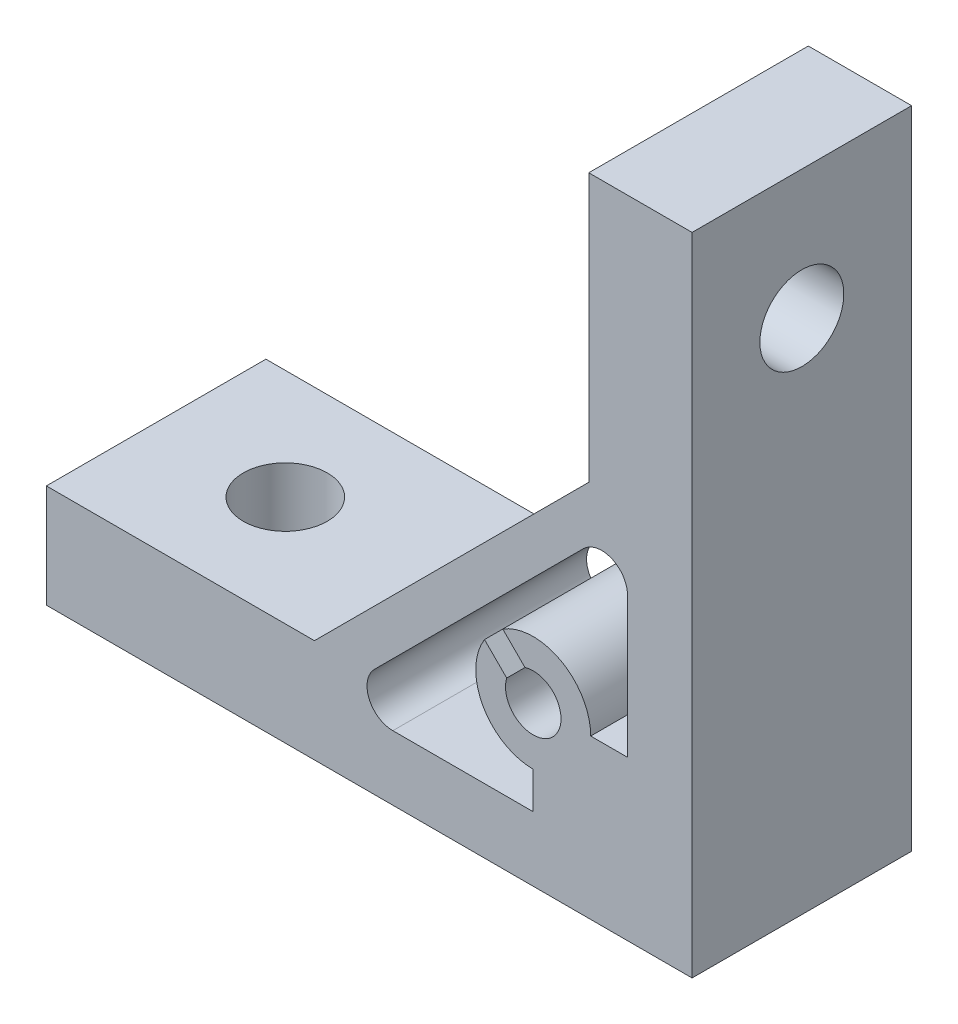
ISO-10303-21;
HEADER;
FILE_DESCRIPTION(('STEP AP214'),'2;1');
FILE_NAME('part.step','',(''),(''),'','','');
FILE_SCHEMA(('AUTOMOTIVE_DESIGN { 1 0 10303 214 1 1 1 1 }'));
ENDSEC;
DATA;
#1=APPLICATION_CONTEXT('core data for automotive mechanical design processes');
#2=APPLICATION_PROTOCOL_DEFINITION('international standard','automotive_design',2000,#1);
#3=PRODUCT_CONTEXT('',#1,'mechanical');
#4=PRODUCT('Part','Part','',(#3));
#5=PRODUCT_RELATED_PRODUCT_CATEGORY('part','',(#4));
#6=PRODUCT_DEFINITION_FORMATION('','',#4);
#7=PRODUCT_DEFINITION_CONTEXT('part definition',#1,'design');
#8=PRODUCT_DEFINITION('design','',#6,#7);
#9=PRODUCT_DEFINITION_SHAPE('','',#8);
#10=(LENGTH_UNIT() NAMED_UNIT(*) SI_UNIT(.MILLI.,.METRE.));
#11=(NAMED_UNIT(*) PLANE_ANGLE_UNIT() SI_UNIT($,.RADIAN.));
#12=(NAMED_UNIT(*) SI_UNIT($,.STERADIAN.) SOLID_ANGLE_UNIT());
#13=UNCERTAINTY_MEASURE_WITH_UNIT(LENGTH_MEASURE(1.E-05),#10,'distance_accuracy_value','');
#14=(GEOMETRIC_REPRESENTATION_CONTEXT(3) GLOBAL_UNCERTAINTY_ASSIGNED_CONTEXT((#13)) GLOBAL_UNIT_ASSIGNED_CONTEXT((#10,
#11,#12)) REPRESENTATION_CONTEXT('',''));
#15=CARTESIAN_POINT('',(0.,0.,0.));
#16=DIRECTION('',(0.,0.,1.));
#17=DIRECTION('',(1.,0.,0.));
#18=AXIS2_PLACEMENT_3D('',#15,#16,#17);
#19=CARTESIAN_POINT('',(50.,0.,8.5));
#20=DIRECTION('',(-1.,0.,0.));
#21=DIRECTION('',(0.,0.,1.));
#22=AXIS2_PLACEMENT_3D('',#19,#20,#21);
#23=PLANE('',#22);
#24=DIRECTION('',(0.,1.,0.));
#25=VECTOR('',#24,1.);
#26=CARTESIAN_POINT('',(50.,0.,-8.5));
#27=LINE('',#26,#25);
#28=CARTESIAN_POINT('',(50.,0.,-8.5));
#29=VERTEX_POINT('',#28);
#30=CARTESIAN_POINT('',(50.,50.,-8.5));
#31=VERTEX_POINT('',#30);
#32=EDGE_CURVE('E283',#29,#31,#27,.T.);
#33=ORIENTED_EDGE('',*,*,#32,.T.);
#34=DIRECTION('',(0.,0.,-1.));
#35=VECTOR('',#34,1.);
#36=CARTESIAN_POINT('',(50.,50.,8.5));
#37=LINE('',#36,#35);
#38=CARTESIAN_POINT('',(50.,50.,8.5));
#39=VERTEX_POINT('',#38);
#40=EDGE_CURVE('E303',#39,#31,#37,.T.);
#41=ORIENTED_EDGE('',*,*,#40,.F.);
#42=DIRECTION('',(0.,1.,0.));
#43=VECTOR('',#42,1.);
#44=CARTESIAN_POINT('',(50.,0.,8.5));
#45=LINE('',#44,#43);
#46=CARTESIAN_POINT('',(50.,0.,8.5));
#47=VERTEX_POINT('',#46);
#48=EDGE_CURVE('E268',#47,#39,#45,.T.);
#49=ORIENTED_EDGE('',*,*,#48,.F.);
#50=DIRECTION('',(0.,0.,-1.));
#51=VECTOR('',#50,1.);
#52=CARTESIAN_POINT('',(50.,0.,8.5));
#53=LINE('',#52,#51);
#54=EDGE_CURVE('E43',#47,#29,#53,.T.);
#55=ORIENTED_EDGE('',*,*,#54,.T.);
#56=EDGE_LOOP('',(#33,#41,#49,#55));
#57=FACE_BOUND('',#56,.T.);
#58=CARTESIAN_POINT('',(50.,40.,0.));
#59=DIRECTION('',(-1.,0.,0.));
#60=DIRECTION('',(0.,0.,1.));
#61=AXIS2_PLACEMENT_3D('',#58,#59,#60);
#62=CIRCLE('',#61,3.25);
#63=CARTESIAN_POINT('',(50.,40.,3.25));
#64=VERTEX_POINT('',#63);
#65=EDGE_CURVE('E368',#64,#64,#62,.F.);
#66=ORIENTED_EDGE('',*,*,#65,.F.);
#67=EDGE_LOOP('',(#66));
#68=FACE_BOUND('',#67,.T.);
#69=ADVANCED_FACE('F35',(#57,#68),#23,.F.);
#70=CARTESIAN_POINT('',(42.,29.2426406871192,8.5));
#71=DIRECTION('',(1.,0.,0.));
#72=DIRECTION('',(0.,0.,-1.));
#73=AXIS2_PLACEMENT_3D('',#70,#71,#72);
#74=PLANE('',#73);
#75=DIRECTION('',(0.,-1.,0.));
#76=VECTOR('',#75,1.);
#77=CARTESIAN_POINT('',(42.,29.2426406871192,-8.5));
#78=LINE('',#77,#76);
#79=CARTESIAN_POINT('',(42.,50.,-8.5));
#80=VERTEX_POINT('',#79);
#81=CARTESIAN_POINT('',(42.,29.2426406871192,-8.5));
#82=VERTEX_POINT('',#81);
#83=EDGE_CURVE('E287',#80,#82,#78,.T.);
#84=ORIENTED_EDGE('',*,*,#83,.T.);
#85=DIRECTION('',(0.,0.,-1.));
#86=VECTOR('',#85,1.);
#87=CARTESIAN_POINT('',(42.,29.2426406871192,8.5));
#88=LINE('',#87,#86);
#89=CARTESIAN_POINT('',(42.,29.2426406871192,8.5));
#90=VERTEX_POINT('',#89);
#91=EDGE_CURVE('E297',#90,#82,#88,.T.);
#92=ORIENTED_EDGE('',*,*,#91,.F.);
#93=DIRECTION('',(0.,-1.,0.));
#94=VECTOR('',#93,1.);
#95=CARTESIAN_POINT('',(42.,29.2426406871192,8.5));
#96=LINE('',#95,#94);
#97=CARTESIAN_POINT('',(42.,50.,8.5));
#98=VERTEX_POINT('',#97);
#99=EDGE_CURVE('E272',#98,#90,#96,.T.);
#100=ORIENTED_EDGE('',*,*,#99,.F.);
#101=DIRECTION('',(0.,0.,-1.));
#102=VECTOR('',#101,1.);
#103=CARTESIAN_POINT('',(42.,50.,8.5));
#104=LINE('',#103,#102);
#105=EDGE_CURVE('E300',#98,#80,#104,.T.);
#106=ORIENTED_EDGE('',*,*,#105,.T.);
#107=EDGE_LOOP('',(#84,#92,#100,#106));
#108=FACE_BOUND('',#107,.T.);
#109=CARTESIAN_POINT('',(42.0000000000001,40.,0.));
#110=DIRECTION('',(1.,0.,0.));
#111=DIRECTION('',(0.,0.,1.));
#112=AXIS2_PLACEMENT_3D('',#109,#110,#111);
#113=CIRCLE('',#112,3.25);
#114=CARTESIAN_POINT('',(42.0000000000001,40.,3.25));
#115=VERTEX_POINT('',#114);
#116=EDGE_CURVE('E373',#115,#115,#113,.T.);
#117=ORIENTED_EDGE('',*,*,#116,.T.);
#118=EDGE_LOOP('',(#117));
#119=FACE_BOUND('',#118,.T.);
#120=ADVANCED_FACE('F326',(#108,#119),#74,.F.);
#121=CARTESIAN_POINT('',(0.,0.,8.5));
#122=DIRECTION('',(0.,0.,1.));
#123=DIRECTION('',(1.,0.,0.));
#124=AXIS2_PLACEMENT_3D('',#121,#122,#123);
#125=PLANE('',#124);
#126=DIRECTION('',(0.,-1.,0.));
#127=VECTOR('',#126,1.);
#128=CARTESIAN_POINT('',(0.,8.,8.5));
#129=LINE('',#128,#127);
#130=CARTESIAN_POINT('',(0.,8.,8.5));
#131=VERTEX_POINT('',#130);
#132=CARTESIAN_POINT('',(0.,0.,8.5));
#133=VERTEX_POINT('',#132);
#134=EDGE_CURVE('E262',#131,#133,#129,.T.);
#135=ORIENTED_EDGE('',*,*,#134,.T.);
#136=DIRECTION('',(1.,0.,0.));
#137=VECTOR('',#136,1.);
#138=CARTESIAN_POINT('',(0.,0.,8.5));
#139=LINE('',#138,#137);
#140=EDGE_CURVE('E265',#133,#47,#139,.T.);
#141=ORIENTED_EDGE('',*,*,#140,.T.);
#142=ORIENTED_EDGE('',*,*,#48,.T.);
#143=DIRECTION('',(-1.,0.,0.));
#144=VECTOR('',#143,1.);
#145=CARTESIAN_POINT('',(42.,50.,8.5));
#146=LINE('',#145,#144);
#147=EDGE_CURVE('E270',#39,#98,#146,.T.);
#148=ORIENTED_EDGE('',*,*,#147,.T.);
#149=ORIENTED_EDGE('',*,*,#99,.T.);
#150=DIRECTION('',(-0.707106781186546,-0.707106781186549,0.));
#151=VECTOR('',#150,1.);
#152=CARTESIAN_POINT('',(20.7573593128809,8.,8.5));
#153=LINE('',#152,#151);
#154=CARTESIAN_POINT('',(20.7573593128809,8.,8.5));
#155=VERTEX_POINT('',#154);
#156=EDGE_CURVE('E274',#90,#155,#153,.T.);
#157=ORIENTED_EDGE('',*,*,#156,.T.);
#158=DIRECTION('',(-1.,0.,0.));
#159=VECTOR('',#158,1.);
#160=CARTESIAN_POINT('',(0.,8.,8.5));
#161=LINE('',#160,#159);
#162=EDGE_CURVE('E276',#155,#131,#161,.T.);
#163=ORIENTED_EDGE('',*,*,#162,.T.);
#164=EDGE_LOOP('',(#135,#141,#142,#148,#149,#157,#163));
#165=FACE_BOUND('',#164,.T.);
#166=DIRECTION('',(0.707106781186549,-0.707106781186546,0.));
#167=VECTOR('',#166,1.);
#168=CARTESIAN_POINT('',(35.647066335444,12.9387201021829,8.5));
#169=LINE('',#168,#167);
#170=CARTESIAN_POINT('',(33.9267474297161,14.6590390079109,8.5));
#171=VERTEX_POINT('',#170);
#172=CARTESIAN_POINT('',(35.647066335444,12.9387201021829,8.5));
#173=VERTEX_POINT('',#172);
#174=EDGE_CURVE('E174',#171,#173,#169,.T.);
#175=ORIENTED_EDGE('',*,*,#174,.F.);
#176=CARTESIAN_POINT('',(37.7,12.3,8.5));
#177=DIRECTION('',(0.,0.,-1.));
#178=DIRECTION('',(1.,0.,0.));
#179=AXIS2_PLACEMENT_3D('',#176,#177,#178);
#180=CIRCLE('',#179,4.45);
#181=CARTESIAN_POINT('',(37.7,7.84999999999995,8.5));
#182=VERTEX_POINT('',#181);
#183=EDGE_CURVE('E166',#182,#171,#180,.T.);
#184=ORIENTED_EDGE('',*,*,#183,.F.);
#185=DIRECTION('',(0.,1.,0.));
#186=VECTOR('',#185,1.);
#187=CARTESIAN_POINT('',(37.7,5.,8.5));
#188=LINE('',#187,#186);
#189=CARTESIAN_POINT('',(37.7,5.,8.5));
#190=VERTEX_POINT('',#189);
#191=EDGE_CURVE('E209',#190,#182,#188,.T.);
#192=ORIENTED_EDGE('',*,*,#191,.F.);
#193=DIRECTION('',(1.,0.,0.));
#194=VECTOR('',#193,1.);
#195=CARTESIAN_POINT('',(26.828427124746,5.,8.5));
#196=LINE('',#195,#194);
#197=CARTESIAN_POINT('',(26.828427124746,4.99999999999993,8.5));
#198=VERTEX_POINT('',#197);
#199=EDGE_CURVE('E207',#198,#190,#196,.T.);
#200=ORIENTED_EDGE('',*,*,#199,.F.);
#201=CARTESIAN_POINT('',(26.8284271247464,7.00000000000011,8.5));
#202=DIRECTION('',(0.,0.,1.));
#203=DIRECTION('',(1.,0.,0.));
#204=AXIS2_PLACEMENT_3D('',#201,#202,#203);
#205=CIRCLE('',#204,2.00000000000019);
#206=CARTESIAN_POINT('',(25.4142135623729,8.41421356237311,8.5));
#207=VERTEX_POINT('',#206);
#208=EDGE_CURVE('E205',#207,#198,#205,.T.);
#209=ORIENTED_EDGE('',*,*,#208,.F.);
#210=DIRECTION('',(-0.70710678118655,-0.707106781186545,0.));
#211=VECTOR('',#210,1.);
#212=CARTESIAN_POINT('',(25.4142135623729,8.41421356237311,8.5));
#213=LINE('',#212,#211);
#214=CARTESIAN_POINT('',(41.585786437627,24.5857864376269,8.5));
#215=VERTEX_POINT('',#214);
#216=EDGE_CURVE('E203',#215,#207,#213,.T.);
#217=ORIENTED_EDGE('',*,*,#216,.F.);
#218=CARTESIAN_POINT('',(43.0000000000002,23.171572875254,8.5));
#219=DIRECTION('',(0.,0.,1.));
#220=DIRECTION('',(1.,0.,0.));
#221=AXIS2_PLACEMENT_3D('',#218,#219,#220);
#222=CIRCLE('',#221,1.99999999999993);
#223=CARTESIAN_POINT('',(45.,23.1715728752539,8.5));
#224=VERTEX_POINT('',#223);
#225=EDGE_CURVE('E201',#224,#215,#222,.T.);
#226=ORIENTED_EDGE('',*,*,#225,.F.);
#227=DIRECTION('',(0.,1.,0.));
#228=VECTOR('',#227,1.);
#229=CARTESIAN_POINT('',(45.,23.1715728752539,8.5));
#230=LINE('',#229,#228);
#231=CARTESIAN_POINT('',(45.,12.3,8.5));
#232=VERTEX_POINT('',#231);
#233=EDGE_CURVE('E199',#232,#224,#230,.T.);
#234=ORIENTED_EDGE('',*,*,#233,.F.);
#235=DIRECTION('',(1.,0.,0.));
#236=VECTOR('',#235,1.);
#237=CARTESIAN_POINT('',(42.15,12.3,8.5));
#238=LINE('',#237,#236);
#239=CARTESIAN_POINT('',(42.15,12.3,8.5));
#240=VERTEX_POINT('',#239);
#241=EDGE_CURVE('E197',#240,#232,#238,.T.);
#242=ORIENTED_EDGE('',*,*,#241,.F.);
#243=CARTESIAN_POINT('',(37.7,12.3,8.5));
#244=DIRECTION('',(0.,0.,-1.));
#245=DIRECTION('',(1.,0.,0.));
#246=AXIS2_PLACEMENT_3D('',#243,#244,#245);
#247=CIRCLE('',#246,4.45);
#248=CARTESIAN_POINT('',(35.3409609920885,16.0732525702836,8.5));
#249=VERTEX_POINT('',#248);
#250=EDGE_CURVE('E195',#249,#240,#247,.T.);
#251=ORIENTED_EDGE('',*,*,#250,.F.);
#252=DIRECTION('',(-0.707106781186684,0.707106781186411,0.));
#253=VECTOR('',#252,1.);
#254=CARTESIAN_POINT('',(37.0612798978168,14.3529336645559,8.5));
#255=LINE('',#254,#253);
#256=CARTESIAN_POINT('',(37.0612798978168,14.3529336645559,8.5));
#257=VERTEX_POINT('',#256);
#258=EDGE_CURVE('E190',#257,#249,#255,.T.);
#259=ORIENTED_EDGE('',*,*,#258,.F.);
#260=CARTESIAN_POINT('',(37.7,12.3,8.5));
#261=DIRECTION('',(0.,0.,1.));
#262=DIRECTION('',(1.,0.,0.));
#263=AXIS2_PLACEMENT_3D('',#260,#261,#262);
#264=CIRCLE('',#263,2.15);
#265=EDGE_CURVE('E188',#173,#257,#264,.T.);
#266=ORIENTED_EDGE('',*,*,#265,.F.);
#267=EDGE_LOOP('',(#175,#184,#192,#200,#209,#217,#226,#234,#242,#251,#259,#266));
#268=FACE_BOUND('',#267,.T.);
#269=ADVANCED_FACE('F186',(#165,#268),#125,.T.);
#270=CARTESIAN_POINT('',(0.,0.,-8.5));
#271=DIRECTION('',(0.,0.,1.));
#272=DIRECTION('',(1.,0.,0.));
#273=AXIS2_PLACEMENT_3D('',#270,#271,#272);
#274=PLANE('',#273);
#275=DIRECTION('',(0.,-1.,0.));
#276=VECTOR('',#275,1.);
#277=CARTESIAN_POINT('',(0.,8.,-8.5));
#278=LINE('',#277,#276);
#279=CARTESIAN_POINT('',(0.,8.,-8.5));
#280=VERTEX_POINT('',#279);
#281=CARTESIAN_POINT('',(0.,0.,-8.5));
#282=VERTEX_POINT('',#281);
#283=EDGE_CURVE('E182',#280,#282,#278,.T.);
#284=ORIENTED_EDGE('',*,*,#283,.F.);
#285=DIRECTION('',(-1.,0.,0.));
#286=VECTOR('',#285,1.);
#287=CARTESIAN_POINT('',(0.,8.,-8.5));
#288=LINE('',#287,#286);
#289=CARTESIAN_POINT('',(20.7573593128809,8.,-8.5));
#290=VERTEX_POINT('',#289);
#291=EDGE_CURVE('E266',#290,#280,#288,.T.);
#292=ORIENTED_EDGE('',*,*,#291,.F.);
#293=DIRECTION('',(-0.707106781186546,-0.707106781186549,0.));
#294=VECTOR('',#293,1.);
#295=CARTESIAN_POINT('',(20.7573593128809,8.,-8.5));
#296=LINE('',#295,#294);
#297=EDGE_CURVE('E289',#82,#290,#296,.T.);
#298=ORIENTED_EDGE('',*,*,#297,.F.);
#299=ORIENTED_EDGE('',*,*,#83,.F.);
#300=DIRECTION('',(-1.,0.,0.));
#301=VECTOR('',#300,1.);
#302=CARTESIAN_POINT('',(42.,50.,-8.5));
#303=LINE('',#302,#301);
#304=EDGE_CURVE('E285',#31,#80,#303,.T.);
#305=ORIENTED_EDGE('',*,*,#304,.F.);
#306=ORIENTED_EDGE('',*,*,#32,.F.);
#307=DIRECTION('',(1.,0.,0.));
#308=VECTOR('',#307,1.);
#309=CARTESIAN_POINT('',(0.,0.,-8.5));
#310=LINE('',#309,#308);
#311=EDGE_CURVE('E281',#282,#29,#310,.T.);
#312=ORIENTED_EDGE('',*,*,#311,.F.);
#313=EDGE_LOOP('',(#284,#292,#298,#299,#305,#306,#312));
#314=FACE_BOUND('',#313,.T.);
#315=CARTESIAN_POINT('',(37.7,12.3,-8.5));
#316=DIRECTION('',(0.,0.,-1.));
#317=DIRECTION('',(1.,0.,0.));
#318=AXIS2_PLACEMENT_3D('',#315,#316,#317);
#319=CIRCLE('',#318,4.45);
#320=CARTESIAN_POINT('',(37.7,7.84999999999995,-8.5));
#321=VERTEX_POINT('',#320);
#322=CARTESIAN_POINT('',(33.9267474297161,14.6590390079109,-8.5));
#323=VERTEX_POINT('',#322);
#324=EDGE_CURVE('E58',#321,#323,#319,.T.);
#325=ORIENTED_EDGE('',*,*,#324,.T.);
#326=DIRECTION('',(0.707106781186549,-0.707106781186546,0.));
#327=VECTOR('',#326,1.);
#328=CARTESIAN_POINT('',(35.647066335444,12.9387201021829,-8.5));
#329=LINE('',#328,#327);
#330=CARTESIAN_POINT('',(35.647066335444,12.9387201021829,-8.5));
#331=VERTEX_POINT('',#330);
#332=EDGE_CURVE('E181',#323,#331,#329,.T.);
#333=ORIENTED_EDGE('',*,*,#332,.T.);
#334=CARTESIAN_POINT('',(37.7,12.3,-8.5));
#335=DIRECTION('',(0.,0.,1.));
#336=DIRECTION('',(1.,0.,0.));
#337=AXIS2_PLACEMENT_3D('',#334,#335,#336);
#338=CIRCLE('',#337,2.15);
#339=CARTESIAN_POINT('',(37.0612798978168,14.3529336645559,-8.5));
#340=VERTEX_POINT('',#339);
#341=EDGE_CURVE('E214',#331,#340,#338,.T.);
#342=ORIENTED_EDGE('',*,*,#341,.T.);
#343=DIRECTION('',(-0.707106781186684,0.707106781186411,0.));
#344=VECTOR('',#343,1.);
#345=CARTESIAN_POINT('',(37.0612798978168,14.3529336645559,-8.5));
#346=LINE('',#345,#344);
#347=CARTESIAN_POINT('',(35.3409609920885,16.0732525702836,-8.5));
#348=VERTEX_POINT('',#347);
#349=EDGE_CURVE('E217',#340,#348,#346,.T.);
#350=ORIENTED_EDGE('',*,*,#349,.T.);
#351=CARTESIAN_POINT('',(37.7,12.3,-8.5));
#352=DIRECTION('',(0.,0.,-1.));
#353=DIRECTION('',(1.,0.,0.));
#354=AXIS2_PLACEMENT_3D('',#351,#352,#353);
#355=CIRCLE('',#354,4.45);
#356=CARTESIAN_POINT('',(42.15,12.3,-8.5));
#357=VERTEX_POINT('',#356);
#358=EDGE_CURVE('E220',#348,#357,#355,.T.);
#359=ORIENTED_EDGE('',*,*,#358,.T.);
#360=DIRECTION('',(1.,0.,0.));
#361=VECTOR('',#360,1.);
#362=CARTESIAN_POINT('',(42.15,12.3,-8.5));
#363=LINE('',#362,#361);
#364=CARTESIAN_POINT('',(45.,12.3,-8.5));
#365=VERTEX_POINT('',#364);
#366=EDGE_CURVE('E223',#357,#365,#363,.T.);
#367=ORIENTED_EDGE('',*,*,#366,.T.);
#368=DIRECTION('',(0.,1.,0.));
#369=VECTOR('',#368,1.);
#370=CARTESIAN_POINT('',(45.,23.1715728752539,-8.5));
#371=LINE('',#370,#369);
#372=CARTESIAN_POINT('',(45.,23.1715728752539,-8.5));
#373=VERTEX_POINT('',#372);
#374=EDGE_CURVE('E226',#365,#373,#371,.T.);
#375=ORIENTED_EDGE('',*,*,#374,.T.);
#376=CARTESIAN_POINT('',(43.0000000000002,23.171572875254,-8.5));
#377=DIRECTION('',(0.,0.,1.));
#378=DIRECTION('',(1.,0.,0.));
#379=AXIS2_PLACEMENT_3D('',#376,#377,#378);
#380=CIRCLE('',#379,1.99999999999993);
#381=CARTESIAN_POINT('',(41.585786437627,24.5857864376269,-8.5));
#382=VERTEX_POINT('',#381);
#383=EDGE_CURVE('E229',#373,#382,#380,.T.);
#384=ORIENTED_EDGE('',*,*,#383,.T.);
#385=DIRECTION('',(-0.70710678118655,-0.707106781186545,0.));
#386=VECTOR('',#385,1.);
#387=CARTESIAN_POINT('',(25.4142135623729,8.41421356237311,-8.5));
#388=LINE('',#387,#386);
#389=CARTESIAN_POINT('',(25.4142135623729,8.41421356237311,-8.5));
#390=VERTEX_POINT('',#389);
#391=EDGE_CURVE('E232',#382,#390,#388,.T.);
#392=ORIENTED_EDGE('',*,*,#391,.T.);
#393=CARTESIAN_POINT('',(26.8284271247464,7.00000000000011,-8.5));
#394=DIRECTION('',(0.,0.,1.));
#395=DIRECTION('',(1.,0.,0.));
#396=AXIS2_PLACEMENT_3D('',#393,#394,#395);
#397=CIRCLE('',#396,2.00000000000019);
#398=CARTESIAN_POINT('',(26.828427124746,4.99999999999993,-8.5));
#399=VERTEX_POINT('',#398);
#400=EDGE_CURVE('E235',#390,#399,#397,.T.);
#401=ORIENTED_EDGE('',*,*,#400,.T.);
#402=DIRECTION('',(1.,0.,0.));
#403=VECTOR('',#402,1.);
#404=CARTESIAN_POINT('',(26.828427124746,5.,-8.5));
#405=LINE('',#404,#403);
#406=CARTESIAN_POINT('',(37.7,5.,-8.5));
#407=VERTEX_POINT('',#406);
#408=EDGE_CURVE('E238',#399,#407,#405,.T.);
#409=ORIENTED_EDGE('',*,*,#408,.T.);
#410=DIRECTION('',(0.,1.,0.));
#411=VECTOR('',#410,1.);
#412=CARTESIAN_POINT('',(37.7,5.,-8.5));
#413=LINE('',#412,#411);
#414=EDGE_CURVE('E175',#407,#321,#413,.T.);
#415=ORIENTED_EDGE('',*,*,#414,.T.);
#416=EDGE_LOOP('',(#325,#333,#342,#350,#359,#367,#375,#384,#392,#401,#409,#415));
#417=FACE_BOUND('',#416,.T.);
#418=ADVANCED_FACE('F316',(#314,#417),#274,.F.);
#419=CARTESIAN_POINT('',(0.,8.,8.5));
#420=DIRECTION('',(1.,0.,0.));
#421=DIRECTION('',(0.,0.,-1.));
#422=AXIS2_PLACEMENT_3D('',#419,#420,#421);
#423=PLANE('',#422);
#424=ORIENTED_EDGE('',*,*,#283,.T.);
#425=DIRECTION('',(0.,0.,-1.));
#426=VECTOR('',#425,1.);
#427=CARTESIAN_POINT('',(0.,0.,8.5));
#428=LINE('',#427,#426);
#429=EDGE_CURVE('E11',#133,#282,#428,.T.);
#430=ORIENTED_EDGE('',*,*,#429,.F.);
#431=ORIENTED_EDGE('',*,*,#134,.F.);
#432=DIRECTION('',(0.,0.,-1.));
#433=VECTOR('',#432,1.);
#434=CARTESIAN_POINT('',(0.,8.,8.5));
#435=LINE('',#434,#433);
#436=EDGE_CURVE('E278',#131,#280,#435,.T.);
#437=ORIENTED_EDGE('',*,*,#436,.T.);
#438=EDGE_LOOP('',(#424,#430,#431,#437));
#439=FACE_BOUND('',#438,.T.);
#440=ADVANCED_FACE('F37',(#439),#423,.F.);
#441=CARTESIAN_POINT('',(0.,0.,8.5));
#442=DIRECTION('',(0.,1.,0.));
#443=DIRECTION('',(0.,0.,1.));
#444=AXIS2_PLACEMENT_3D('',#441,#442,#443);
#445=PLANE('',#444);
#446=CARTESIAN_POINT('',(10.,0.,0.));
#447=DIRECTION('',(0.,1.,0.));
#448=DIRECTION('',(0.,0.,1.));
#449=AXIS2_PLACEMENT_3D('',#446,#447,#448);
#450=CIRCLE('',#449,3.25);
#451=CARTESIAN_POINT('',(10.,0.,3.25));
#452=VERTEX_POINT('',#451);
#453=EDGE_CURVE('E212',#452,#452,#450,.T.);
#454=ORIENTED_EDGE('',*,*,#453,.T.);
#455=EDGE_LOOP('',(#454));
#456=FACE_BOUND('',#455,.T.);
#457=ORIENTED_EDGE('',*,*,#311,.T.);
#458=ORIENTED_EDGE('',*,*,#54,.F.);
#459=ORIENTED_EDGE('',*,*,#140,.F.);
#460=ORIENTED_EDGE('',*,*,#429,.T.);
#461=EDGE_LOOP('',(#457,#458,#459,#460));
#462=FACE_BOUND('',#461,.T.);
#463=ADVANCED_FACE('F334',(#456,#462),#445,.F.);
#464=CARTESIAN_POINT('',(42.,50.,8.5));
#465=DIRECTION('',(0.,-1.,0.));
#466=DIRECTION('',(0.,0.,-1.));
#467=AXIS2_PLACEMENT_3D('',#464,#465,#466);
#468=PLANE('',#467);
#469=ORIENTED_EDGE('',*,*,#304,.T.);
#470=ORIENTED_EDGE('',*,*,#105,.F.);
#471=ORIENTED_EDGE('',*,*,#147,.F.);
#472=ORIENTED_EDGE('',*,*,#40,.T.);
#473=EDGE_LOOP('',(#469,#470,#471,#472));
#474=FACE_BOUND('',#473,.T.);
#475=ADVANCED_FACE('F322',(#474),#468,.F.);
#476=CARTESIAN_POINT('',(20.7573593128809,8.,8.5));
#477=DIRECTION('',(0.707106781186549,-0.707106781186546,0.));
#478=DIRECTION('',(0.707106781186546,0.707106781186549,0.));
#479=AXIS2_PLACEMENT_3D('',#476,#477,#478);
#480=PLANE('',#479);
#481=ORIENTED_EDGE('',*,*,#297,.T.);
#482=DIRECTION('',(0.,0.,-1.));
#483=VECTOR('',#482,1.);
#484=CARTESIAN_POINT('',(20.7573593128809,8.,8.5));
#485=LINE('',#484,#483);
#486=EDGE_CURVE('E294',#155,#290,#485,.T.);
#487=ORIENTED_EDGE('',*,*,#486,.F.);
#488=ORIENTED_EDGE('',*,*,#156,.F.);
#489=ORIENTED_EDGE('',*,*,#91,.T.);
#490=EDGE_LOOP('',(#481,#487,#488,#489));
#491=FACE_BOUND('',#490,.T.);
#492=ADVANCED_FACE('F342',(#491),#480,.F.);
#493=CARTESIAN_POINT('',(0.,8.,8.5));
#494=DIRECTION('',(0.,-1.,0.));
#495=DIRECTION('',(0.,0.,-1.));
#496=AXIS2_PLACEMENT_3D('',#493,#494,#495);
#497=PLANE('',#496);
#498=CARTESIAN_POINT('',(10.,8.,0.));
#499=DIRECTION('',(0.,1.,0.));
#500=DIRECTION('',(0.,0.,1.));
#501=AXIS2_PLACEMENT_3D('',#498,#499,#500);
#502=CIRCLE('',#501,3.25);
#503=CARTESIAN_POINT('',(10.,8.,3.25));
#504=VERTEX_POINT('',#503);
#505=EDGE_CURVE('E366',#504,#504,#502,.T.);
#506=ORIENTED_EDGE('',*,*,#505,.F.);
#507=EDGE_LOOP('',(#506));
#508=FACE_BOUND('',#507,.T.);
#509=ORIENTED_EDGE('',*,*,#291,.T.);
#510=ORIENTED_EDGE('',*,*,#436,.F.);
#511=ORIENTED_EDGE('',*,*,#162,.F.);
#512=ORIENTED_EDGE('',*,*,#486,.T.);
#513=EDGE_LOOP('',(#509,#510,#511,#512));
#514=FACE_BOUND('',#513,.T.);
#515=ADVANCED_FACE('F339',(#508,#514),#497,.F.);
#516=CARTESIAN_POINT('',(37.7,12.3,8.5));
#517=DIRECTION('',(0.,0.,-1.));
#518=DIRECTION('',(-1.,0.,0.));
#519=AXIS2_PLACEMENT_3D('',#516,#517,#518);
#520=CYLINDRICAL_SURFACE('',#519,4.45);
#521=ORIENTED_EDGE('',*,*,#324,.F.);
#522=DIRECTION('',(0.,0.,-1.));
#523=VECTOR('',#522,1.);
#524=CARTESIAN_POINT('',(37.7,7.84999999999995,8.5));
#525=LINE('',#524,#523);
#526=EDGE_CURVE('E170',#182,#321,#525,.T.);
#527=ORIENTED_EDGE('',*,*,#526,.F.);
#528=ORIENTED_EDGE('',*,*,#183,.T.);
#529=DIRECTION('',(0.,0.,-1.));
#530=VECTOR('',#529,1.);
#531=CARTESIAN_POINT('',(33.9267474297161,14.6590390079109,8.5));
#532=LINE('',#531,#530);
#533=EDGE_CURVE('E169',#171,#323,#532,.T.);
#534=ORIENTED_EDGE('',*,*,#533,.T.);
#535=EDGE_LOOP('',(#521,#527,#528,#534));
#536=FACE_BOUND('',#535,.T.);
#537=ADVANCED_FACE('F168',(#536),#520,.T.);
#538=CARTESIAN_POINT('',(35.647066335444,12.9387201021829,8.5));
#539=DIRECTION('',(0.707106781186546,0.707106781186549,0.));
#540=DIRECTION('',(-0.707106781186549,0.707106781186546,0.));
#541=AXIS2_PLACEMENT_3D('',#538,#539,#540);
#542=PLANE('',#541);
#543=ORIENTED_EDGE('',*,*,#332,.F.);
#544=ORIENTED_EDGE('',*,*,#533,.F.);
#545=ORIENTED_EDGE('',*,*,#174,.T.);
#546=DIRECTION('',(0.,0.,-1.));
#547=VECTOR('',#546,1.);
#548=CARTESIAN_POINT('',(35.647066335444,12.9387201021829,8.5));
#549=LINE('',#548,#547);
#550=EDGE_CURVE('E183',#173,#331,#549,.T.);
#551=ORIENTED_EDGE('',*,*,#550,.T.);
#552=EDGE_LOOP('',(#543,#544,#545,#551));
#553=FACE_BOUND('',#552,.T.);
#554=ADVANCED_FACE('F178',(#553),#542,.T.);
#555=CARTESIAN_POINT('',(37.7,12.3,8.5));
#556=DIRECTION('',(0.,0.,-1.));
#557=DIRECTION('',(-1.,0.,0.));
#558=AXIS2_PLACEMENT_3D('',#555,#556,#557);
#559=CYLINDRICAL_SURFACE('',#558,2.15);
#560=ORIENTED_EDGE('',*,*,#341,.F.);
#561=ORIENTED_EDGE('',*,*,#550,.F.);
#562=ORIENTED_EDGE('',*,*,#265,.T.);
#563=DIRECTION('',(0.,0.,-1.));
#564=VECTOR('',#563,1.);
#565=CARTESIAN_POINT('',(37.0612798978168,14.3529336645559,8.5));
#566=LINE('',#565,#564);
#567=EDGE_CURVE('E259',#257,#340,#566,.T.);
#568=ORIENTED_EDGE('',*,*,#567,.T.);
#569=EDGE_LOOP('',(#560,#561,#562,#568));
#570=FACE_BOUND('',#569,.T.);
#571=ADVANCED_FACE('F423',(#570),#559,.F.);
#572=CARTESIAN_POINT('',(37.0612798978168,14.3529336645559,8.5));
#573=DIRECTION('',(-0.707106781186411,-0.707106781186684,0.));
#574=DIRECTION('',(0.707106781186684,-0.707106781186411,0.));
#575=AXIS2_PLACEMENT_3D('',#572,#573,#574);
#576=PLANE('',#575);
#577=ORIENTED_EDGE('',*,*,#349,.F.);
#578=ORIENTED_EDGE('',*,*,#567,.F.);
#579=ORIENTED_EDGE('',*,*,#258,.T.);
#580=DIRECTION('',(0.,0.,-1.));
#581=VECTOR('',#580,1.);
#582=CARTESIAN_POINT('',(35.3409609920885,16.0732525702836,8.5));
#583=LINE('',#582,#581);
#584=EDGE_CURVE('E257',#249,#348,#583,.T.);
#585=ORIENTED_EDGE('',*,*,#584,.T.);
#586=EDGE_LOOP('',(#577,#578,#579,#585));
#587=FACE_BOUND('',#586,.T.);
#588=ADVANCED_FACE('F419',(#587),#576,.T.);
#589=CARTESIAN_POINT('',(37.7,12.3,8.5));
#590=DIRECTION('',(0.,0.,-1.));
#591=DIRECTION('',(-1.,0.,0.));
#592=AXIS2_PLACEMENT_3D('',#589,#590,#591);
#593=CYLINDRICAL_SURFACE('',#592,4.45);
#594=ORIENTED_EDGE('',*,*,#358,.F.);
#595=ORIENTED_EDGE('',*,*,#584,.F.);
#596=ORIENTED_EDGE('',*,*,#250,.T.);
#597=DIRECTION('',(0.,0.,-1.));
#598=VECTOR('',#597,1.);
#599=CARTESIAN_POINT('',(42.15,12.3,8.5));
#600=LINE('',#599,#598);
#601=EDGE_CURVE('E255',#240,#357,#600,.T.);
#602=ORIENTED_EDGE('',*,*,#601,.T.);
#603=EDGE_LOOP('',(#594,#595,#596,#602));
#604=FACE_BOUND('',#603,.T.);
#605=ADVANCED_FACE('F415',(#604),#593,.T.);
#606=CARTESIAN_POINT('',(42.15,12.3,8.5));
#607=DIRECTION('',(0.,1.,0.));
#608=DIRECTION('',(0.,0.,1.));
#609=AXIS2_PLACEMENT_3D('',#606,#607,#608);
#610=PLANE('',#609);
#611=ORIENTED_EDGE('',*,*,#366,.F.);
#612=ORIENTED_EDGE('',*,*,#601,.F.);
#613=ORIENTED_EDGE('',*,*,#241,.T.);
#614=DIRECTION('',(0.,0.,-1.));
#615=VECTOR('',#614,1.);
#616=CARTESIAN_POINT('',(45.,12.3,8.5));
#617=LINE('',#616,#615);
#618=EDGE_CURVE('E253',#232,#365,#617,.T.);
#619=ORIENTED_EDGE('',*,*,#618,.T.);
#620=EDGE_LOOP('',(#611,#612,#613,#619));
#621=FACE_BOUND('',#620,.T.);
#622=ADVANCED_FACE('F411',(#621),#610,.T.);
#623=CARTESIAN_POINT('',(45.,23.1715728752539,8.5));
#624=DIRECTION('',(-1.,0.,0.));
#625=DIRECTION('',(0.,0.,1.));
#626=AXIS2_PLACEMENT_3D('',#623,#624,#625);
#627=PLANE('',#626);
#628=ORIENTED_EDGE('',*,*,#374,.F.);
#629=ORIENTED_EDGE('',*,*,#618,.F.);
#630=ORIENTED_EDGE('',*,*,#233,.T.);
#631=DIRECTION('',(0.,0.,-1.));
#632=VECTOR('',#631,1.);
#633=CARTESIAN_POINT('',(45.,23.1715728752539,8.5));
#634=LINE('',#633,#632);
#635=EDGE_CURVE('E251',#224,#373,#634,.T.);
#636=ORIENTED_EDGE('',*,*,#635,.T.);
#637=EDGE_LOOP('',(#628,#629,#630,#636));
#638=FACE_BOUND('',#637,.T.);
#639=ADVANCED_FACE('F407',(#638),#627,.T.);
#640=CARTESIAN_POINT('',(43.0000000000002,23.171572875254,8.5));
#641=DIRECTION('',(0.,0.,-1.));
#642=DIRECTION('',(-1.,0.,0.));
#643=AXIS2_PLACEMENT_3D('',#640,#641,#642);
#644=CYLINDRICAL_SURFACE('',#643,1.99999999999993);
#645=ORIENTED_EDGE('',*,*,#383,.F.);
#646=ORIENTED_EDGE('',*,*,#635,.F.);
#647=ORIENTED_EDGE('',*,*,#225,.T.);
#648=DIRECTION('',(0.,0.,-1.));
#649=VECTOR('',#648,1.);
#650=CARTESIAN_POINT('',(41.585786437627,24.5857864376269,8.5));
#651=LINE('',#650,#649);
#652=EDGE_CURVE('E249',#215,#382,#651,.T.);
#653=ORIENTED_EDGE('',*,*,#652,.T.);
#654=EDGE_LOOP('',(#645,#646,#647,#653));
#655=FACE_BOUND('',#654,.T.);
#656=ADVANCED_FACE('F403',(#655),#644,.F.);
#657=CARTESIAN_POINT('',(25.4142135623729,8.41421356237311,8.5));
#658=DIRECTION('',(0.707106781186545,-0.70710678118655,0.));
#659=DIRECTION('',(0.70710678118655,0.707106781186545,0.));
#660=AXIS2_PLACEMENT_3D('',#657,#658,#659);
#661=PLANE('',#660);
#662=ORIENTED_EDGE('',*,*,#391,.F.);
#663=ORIENTED_EDGE('',*,*,#652,.F.);
#664=ORIENTED_EDGE('',*,*,#216,.T.);
#665=DIRECTION('',(0.,0.,-1.));
#666=VECTOR('',#665,1.);
#667=CARTESIAN_POINT('',(25.4142135623729,8.41421356237311,8.5));
#668=LINE('',#667,#666);
#669=EDGE_CURVE('E247',#207,#390,#668,.T.);
#670=ORIENTED_EDGE('',*,*,#669,.T.);
#671=EDGE_LOOP('',(#662,#663,#664,#670));
#672=FACE_BOUND('',#671,.T.);
#673=ADVANCED_FACE('F399',(#672),#661,.T.);
#674=CARTESIAN_POINT('',(26.8284271247464,7.00000000000011,8.5));
#675=DIRECTION('',(0.,0.,-1.));
#676=DIRECTION('',(-1.,0.,0.));
#677=AXIS2_PLACEMENT_3D('',#674,#675,#676);
#678=CYLINDRICAL_SURFACE('',#677,2.00000000000019);
#679=ORIENTED_EDGE('',*,*,#400,.F.);
#680=ORIENTED_EDGE('',*,*,#669,.F.);
#681=ORIENTED_EDGE('',*,*,#208,.T.);
#682=DIRECTION('',(0.,0.,-1.));
#683=VECTOR('',#682,1.);
#684=CARTESIAN_POINT('',(26.828427124746,4.99999999999993,8.5));
#685=LINE('',#684,#683);
#686=EDGE_CURVE('E245',#198,#399,#685,.T.);
#687=ORIENTED_EDGE('',*,*,#686,.T.);
#688=EDGE_LOOP('',(#679,#680,#681,#687));
#689=FACE_BOUND('',#688,.T.);
#690=ADVANCED_FACE('F395',(#689),#678,.F.);
#691=CARTESIAN_POINT('',(26.828427124746,5.,8.5));
#692=DIRECTION('',(0.,1.,0.));
#693=DIRECTION('',(0.,0.,1.));
#694=AXIS2_PLACEMENT_3D('',#691,#692,#693);
#695=PLANE('',#694);
#696=ORIENTED_EDGE('',*,*,#408,.F.);
#697=ORIENTED_EDGE('',*,*,#686,.F.);
#698=ORIENTED_EDGE('',*,*,#199,.T.);
#699=DIRECTION('',(0.,0.,-1.));
#700=VECTOR('',#699,1.);
#701=CARTESIAN_POINT('',(37.7,5.,8.5));
#702=LINE('',#701,#700);
#703=EDGE_CURVE('E50',#190,#407,#702,.T.);
#704=ORIENTED_EDGE('',*,*,#703,.T.);
#705=EDGE_LOOP('',(#696,#697,#698,#704));
#706=FACE_BOUND('',#705,.T.);
#707=ADVANCED_FACE('F392',(#706),#695,.T.);
#708=CARTESIAN_POINT('',(37.7,5.,8.5));
#709=DIRECTION('',(-1.,0.,0.));
#710=DIRECTION('',(0.,0.,1.));
#711=AXIS2_PLACEMENT_3D('',#708,#709,#710);
#712=PLANE('',#711);
#713=ORIENTED_EDGE('',*,*,#414,.F.);
#714=ORIENTED_EDGE('',*,*,#703,.F.);
#715=ORIENTED_EDGE('',*,*,#191,.T.);
#716=ORIENTED_EDGE('',*,*,#526,.T.);
#717=EDGE_LOOP('',(#713,#714,#715,#716));
#718=FACE_BOUND('',#717,.T.);
#719=ADVANCED_FACE('F386',(#718),#712,.T.);
#720=CARTESIAN_POINT('',(10.,-9.,0.));
#721=DIRECTION('',(0.,1.,0.));
#722=DIRECTION('',(0.,0.,1.));
#723=AXIS2_PLACEMENT_3D('',#720,#721,#722);
#724=CYLINDRICAL_SURFACE('',#723,3.25);
#725=ORIENTED_EDGE('',*,*,#505,.T.);
#726=EDGE_LOOP('',(#725));
#727=FACE_BOUND('',#726,.T.);
#728=ORIENTED_EDGE('',*,*,#453,.F.);
#729=EDGE_LOOP('',(#728));
#730=FACE_BOUND('',#729,.T.);
#731=ADVANCED_FACE('F380',(#727,#730),#724,.F.);
#732=CARTESIAN_POINT('',(59.0000000000001,40.,0.));
#733=DIRECTION('',(-1.,0.,0.));
#734=DIRECTION('',(0.,-1.,0.));
#735=AXIS2_PLACEMENT_3D('',#732,#733,#734);
#736=CYLINDRICAL_SURFACE('',#735,3.25);
#737=ORIENTED_EDGE('',*,*,#116,.F.);
#738=EDGE_LOOP('',(#737));
#739=FACE_BOUND('',#738,.T.);
#740=ORIENTED_EDGE('',*,*,#65,.T.);
#741=EDGE_LOOP('',(#740));
#742=FACE_BOUND('',#741,.T.);
#743=ADVANCED_FACE('F377',(#739,#742),#736,.F.);
#744=CLOSED_SHELL('',(#69,#120,#269,#418,#440,#463,#475,#492,#515,#537,#554,#571,#588,#605,#622,
#639,#656,#673,#690,#707,#719,#731,#743));
#745=MANIFOLD_SOLID_BREP('B2',#744);
#746=ADVANCED_BREP_SHAPE_REPRESENTATION('',(#18,#745),#14);
#747=SHAPE_DEFINITION_REPRESENTATION(#9,#746);
ENDSEC;
END-ISO-10303-21;
